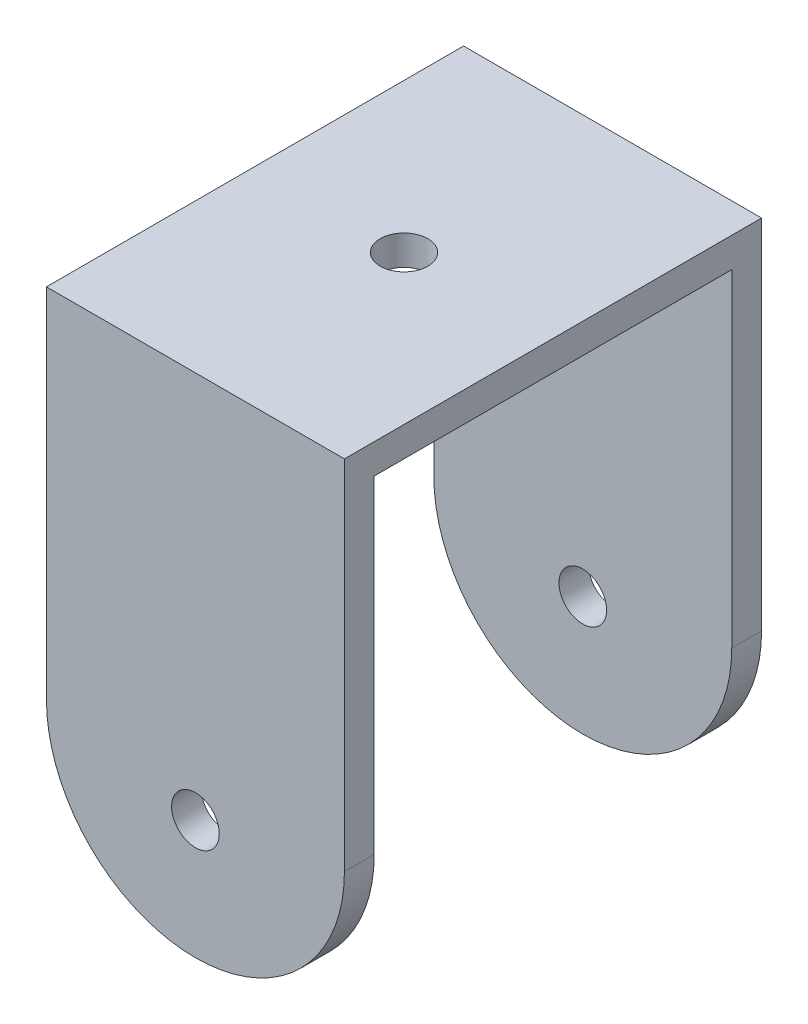
ISO-10303-21;
HEADER;
FILE_DESCRIPTION(('STEP AP214'),'2;1');
FILE_NAME('part.step','',(''),(''),'','','');
FILE_SCHEMA(('AUTOMOTIVE_DESIGN { 1 0 10303 214 1 1 1 1 }'));
ENDSEC;
DATA;
#1=APPLICATION_CONTEXT('core data for automotive mechanical design processes');
#2=APPLICATION_PROTOCOL_DEFINITION('international standard','automotive_design',2000,#1);
#3=PRODUCT_CONTEXT('',#1,'mechanical');
#4=PRODUCT('Part','Part','',(#3));
#5=PRODUCT_RELATED_PRODUCT_CATEGORY('part','',(#4));
#6=PRODUCT_DEFINITION_FORMATION('','',#4);
#7=PRODUCT_DEFINITION_CONTEXT('part definition',#1,'design');
#8=PRODUCT_DEFINITION('design','',#6,#7);
#9=PRODUCT_DEFINITION_SHAPE('','',#8);
#10=(LENGTH_UNIT() NAMED_UNIT(*) SI_UNIT(.MILLI.,.METRE.));
#11=(NAMED_UNIT(*) PLANE_ANGLE_UNIT() SI_UNIT($,.RADIAN.));
#12=(NAMED_UNIT(*) SI_UNIT($,.STERADIAN.) SOLID_ANGLE_UNIT());
#13=UNCERTAINTY_MEASURE_WITH_UNIT(LENGTH_MEASURE(1.E-05),#10,'distance_accuracy_value','');
#14=(GEOMETRIC_REPRESENTATION_CONTEXT(3) GLOBAL_UNCERTAINTY_ASSIGNED_CONTEXT((#13)) GLOBAL_UNIT_ASSIGNED_CONTEXT((#10,
#11,#12)) REPRESENTATION_CONTEXT('',''));
#15=CARTESIAN_POINT('',(0.,0.,0.));
#16=DIRECTION('',(0.,0.,1.));
#17=DIRECTION('',(1.,0.,0.));
#18=AXIS2_PLACEMENT_3D('',#15,#16,#17);
#19=CARTESIAN_POINT('',(0.,40.,0.));
#20=DIRECTION('',(0.,1.,0.));
#21=DIRECTION('',(-1.,0.,0.));
#22=AXIS2_PLACEMENT_3D('',#19,#20,#21);
#23=PLANE('',#22);
#24=CARTESIAN_POINT('',(0.,40.,35.));
#25=DIRECTION('',(0.,1.,0.));
#26=DIRECTION('',(-1.,0.,0.));
#27=AXIS2_PLACEMENT_3D('',#24,#25,#26);
#28=CIRCLE('',#27,4.);
#29=CARTESIAN_POINT('',(-4.00000000000001,40.,35.));
#30=VERTEX_POINT('',#29);
#31=EDGE_CURVE('E233',#30,#30,#28,.T.);
#32=ORIENTED_EDGE('',*,*,#31,.T.);
#33=EDGE_LOOP('',(#32));
#34=FACE_BOUND('',#33,.T.);
#35=DIRECTION('',(-1.,0.,0.));
#36=VECTOR('',#35,1.);
#37=CARTESIAN_POINT('',(25.,40.,65.));
#38=LINE('',#37,#36);
#39=CARTESIAN_POINT('',(25.,40.,65.));
#40=VERTEX_POINT('',#39);
#41=CARTESIAN_POINT('',(-25.,40.,65.));
#42=VERTEX_POINT('',#41);
#43=EDGE_CURVE('E129',#40,#42,#38,.T.);
#44=ORIENTED_EDGE('',*,*,#43,.T.);
#45=DIRECTION('',(0.,0.,1.));
#46=VECTOR('',#45,1.);
#47=CARTESIAN_POINT('',(-25.,40.,0.));
#48=LINE('',#47,#46);
#49=CARTESIAN_POINT('',(-25.,40.,5.));
#50=VERTEX_POINT('',#49);
#51=EDGE_CURVE('E138',#50,#42,#48,.T.);
#52=ORIENTED_EDGE('',*,*,#51,.F.);
#53=DIRECTION('',(-1.,0.,0.));
#54=VECTOR('',#53,1.);
#55=CARTESIAN_POINT('',(-25.,40.,5.));
#56=LINE('',#55,#54);
#57=CARTESIAN_POINT('',(25.,40.,5.));
#58=VERTEX_POINT('',#57);
#59=EDGE_CURVE('E135',#58,#50,#56,.T.);
#60=ORIENTED_EDGE('',*,*,#59,.F.);
#61=DIRECTION('',(0.,0.,-1.));
#62=VECTOR('',#61,1.);
#63=CARTESIAN_POINT('',(25.,40.,0.));
#64=LINE('',#63,#62);
#65=EDGE_CURVE('E122',#40,#58,#64,.T.);
#66=ORIENTED_EDGE('',*,*,#65,.F.);
#67=EDGE_LOOP('',(#44,#52,#60,#66));
#68=FACE_BOUND('',#67,.T.);
#69=ADVANCED_FACE('F39',(#34,#68),#23,.F.);
#70=CARTESIAN_POINT('',(25.,40.,5.));
#71=DIRECTION('',(-1.,0.,0.));
#72=DIRECTION('',(0.,-1.,0.));
#73=AXIS2_PLACEMENT_3D('',#70,#71,#72);
#74=PLANE('',#73);
#75=DIRECTION('',(0.,1.,0.));
#76=VECTOR('',#75,1.);
#77=CARTESIAN_POINT('',(25.,40.,5.));
#78=LINE('',#77,#76);
#79=CARTESIAN_POINT('',(25.,-15.,5.));
#80=VERTEX_POINT('',#79);
#81=EDGE_CURVE('E173',#80,#58,#78,.T.);
#82=ORIENTED_EDGE('',*,*,#81,.F.);
#83=DIRECTION('',(0.,0.,-1.));
#84=VECTOR('',#83,1.);
#85=CARTESIAN_POINT('',(25.,-15.,5.));
#86=LINE('',#85,#84);
#87=CARTESIAN_POINT('',(25.,-15.,0.));
#88=VERTEX_POINT('',#87);
#89=EDGE_CURVE('E214',#80,#88,#86,.T.);
#90=ORIENTED_EDGE('',*,*,#89,.T.);
#91=DIRECTION('',(0.,1.,0.));
#92=VECTOR('',#91,1.);
#93=CARTESIAN_POINT('',(25.,40.,0.));
#94=LINE('',#93,#92);
#95=CARTESIAN_POINT('',(25.,45.,0.));
#96=VERTEX_POINT('',#95);
#97=EDGE_CURVE('E172',#88,#96,#94,.T.);
#98=ORIENTED_EDGE('',*,*,#97,.T.);
#99=DIRECTION('',(0.,0.,-1.));
#100=VECTOR('',#99,1.);
#101=CARTESIAN_POINT('',(25.,45.,0.));
#102=LINE('',#101,#100);
#103=CARTESIAN_POINT('',(25.,45.,70.));
#104=VERTEX_POINT('',#103);
#105=EDGE_CURVE('E156',#104,#96,#102,.T.);
#106=ORIENTED_EDGE('',*,*,#105,.F.);
#107=DIRECTION('',(0.,-1.,0.));
#108=VECTOR('',#107,1.);
#109=CARTESIAN_POINT('',(25.,45.,70.));
#110=LINE('',#109,#108);
#111=CARTESIAN_POINT('',(25.,-15.,70.));
#112=VERTEX_POINT('',#111);
#113=EDGE_CURVE('E164',#104,#112,#110,.T.);
#114=ORIENTED_EDGE('',*,*,#113,.T.);
#115=DIRECTION('',(0.,0.,-1.));
#116=VECTOR('',#115,1.);
#117=CARTESIAN_POINT('',(25.,-15.,5.));
#118=LINE('',#117,#116);
#119=CARTESIAN_POINT('',(25.,-15.,65.));
#120=VERTEX_POINT('',#119);
#121=EDGE_CURVE('E126',#112,#120,#118,.T.);
#122=ORIENTED_EDGE('',*,*,#121,.T.);
#123=DIRECTION('',(0.,1.,0.));
#124=VECTOR('',#123,1.);
#125=CARTESIAN_POINT('',(25.,-40.,65.));
#126=LINE('',#125,#124);
#127=EDGE_CURVE('E118',#120,#40,#126,.T.);
#128=ORIENTED_EDGE('',*,*,#127,.T.);
#129=ORIENTED_EDGE('',*,*,#65,.T.);
#130=EDGE_LOOP('',(#82,#90,#98,#106,#114,#122,#128,#129));
#131=FACE_BOUND('',#130,.T.);
#132=ADVANCED_FACE('F121',(#131),#74,.F.);
#133=CARTESIAN_POINT('',(-25.,40.,5.));
#134=DIRECTION('',(1.,0.,0.));
#135=DIRECTION('',(0.,1.,0.));
#136=AXIS2_PLACEMENT_3D('',#133,#134,#135);
#137=PLANE('',#136);
#138=DIRECTION('',(0.,-1.,0.));
#139=VECTOR('',#138,1.);
#140=CARTESIAN_POINT('',(-25.,40.,0.));
#141=LINE('',#140,#139);
#142=CARTESIAN_POINT('',(-25.,45.,0.));
#143=VERTEX_POINT('',#142);
#144=CARTESIAN_POINT('',(-25.,-15.,0.));
#145=VERTEX_POINT('',#144);
#146=EDGE_CURVE('E176',#143,#145,#141,.T.);
#147=ORIENTED_EDGE('',*,*,#146,.T.);
#148=DIRECTION('',(0.,0.,-1.));
#149=VECTOR('',#148,1.);
#150=CARTESIAN_POINT('',(-25.,-15.,5.));
#151=LINE('',#150,#149);
#152=CARTESIAN_POINT('',(-25.,-15.,5.));
#153=VERTEX_POINT('',#152);
#154=EDGE_CURVE('E202',#145,#153,#151,.F.);
#155=ORIENTED_EDGE('',*,*,#154,.T.);
#156=DIRECTION('',(0.,-1.,0.));
#157=VECTOR('',#156,1.);
#158=CARTESIAN_POINT('',(-25.,40.,5.));
#159=LINE('',#158,#157);
#160=EDGE_CURVE('E179',#50,#153,#159,.T.);
#161=ORIENTED_EDGE('',*,*,#160,.F.);
#162=ORIENTED_EDGE('',*,*,#51,.T.);
#163=DIRECTION('',(0.,-1.,0.));
#164=VECTOR('',#163,1.);
#165=CARTESIAN_POINT('',(-25.,40.,65.));
#166=LINE('',#165,#164);
#167=CARTESIAN_POINT('',(-25.,-15.,65.));
#168=VERTEX_POINT('',#167);
#169=EDGE_CURVE('E143',#42,#168,#166,.T.);
#170=ORIENTED_EDGE('',*,*,#169,.T.);
#171=DIRECTION('',(0.,0.,-1.));
#172=VECTOR('',#171,1.);
#173=CARTESIAN_POINT('',(-25.,-15.,5.));
#174=LINE('',#173,#172);
#175=CARTESIAN_POINT('',(-25.,-15.,70.));
#176=VERTEX_POINT('',#175);
#177=EDGE_CURVE('E199',#168,#176,#174,.F.);
#178=ORIENTED_EDGE('',*,*,#177,.T.);
#179=DIRECTION('',(0.,-1.,0.));
#180=VECTOR('',#179,1.);
#181=CARTESIAN_POINT('',(-25.,45.,70.));
#182=LINE('',#181,#180);
#183=CARTESIAN_POINT('',(-25.,45.,70.));
#184=VERTEX_POINT('',#183);
#185=EDGE_CURVE('E169',#184,#176,#182,.T.);
#186=ORIENTED_EDGE('',*,*,#185,.F.);
#187=DIRECTION('',(0.,0.,1.));
#188=VECTOR('',#187,1.);
#189=CARTESIAN_POINT('',(-25.,45.,0.));
#190=LINE('',#189,#188);
#191=EDGE_CURVE('E137',#143,#184,#190,.T.);
#192=ORIENTED_EDGE('',*,*,#191,.F.);
#193=EDGE_LOOP('',(#147,#155,#161,#162,#170,#178,#186,#192));
#194=FACE_BOUND('',#193,.T.);
#195=ADVANCED_FACE('F242',(#194),#137,.F.);
#196=CARTESIAN_POINT('',(0.,0.,5.));
#197=DIRECTION('',(0.,0.,1.));
#198=DIRECTION('',(1.,0.,0.));
#199=AXIS2_PLACEMENT_3D('',#196,#197,#198);
#200=PLANE('',#199);
#201=CARTESIAN_POINT('',(0.,-20.,5.));
#202=DIRECTION('',(0.,0.,1.));
#203=DIRECTION('',(1.,0.,0.));
#204=AXIS2_PLACEMENT_3D('',#201,#202,#203);
#205=CIRCLE('',#204,4.);
#206=CARTESIAN_POINT('',(4.00000000000001,-20.,5.));
#207=VERTEX_POINT('',#206);
#208=EDGE_CURVE('E130',#207,#207,#205,.T.);
#209=ORIENTED_EDGE('',*,*,#208,.F.);
#210=EDGE_LOOP('',(#209));
#211=FACE_BOUND('',#210,.T.);
#212=ORIENTED_EDGE('',*,*,#160,.T.);
#213=CARTESIAN_POINT('',(0.,-15.,5.));
#214=DIRECTION('',(0.,0.,1.));
#215=DIRECTION('',(1.,0.,0.));
#216=AXIS2_PLACEMENT_3D('',#213,#214,#215);
#217=CIRCLE('',#216,25.);
#218=CARTESIAN_POINT('',(0.,-40.,5.));
#219=VERTEX_POINT('',#218);
#220=EDGE_CURVE('E209',#153,#219,#217,.T.);
#221=ORIENTED_EDGE('',*,*,#220,.T.);
#222=CARTESIAN_POINT('',(0.,-15.,5.));
#223=DIRECTION('',(0.,0.,1.));
#224=DIRECTION('',(1.,0.,0.));
#225=AXIS2_PLACEMENT_3D('',#222,#223,#224);
#226=CIRCLE('',#225,25.);
#227=EDGE_CURVE('E206',#219,#80,#226,.T.);
#228=ORIENTED_EDGE('',*,*,#227,.T.);
#229=ORIENTED_EDGE('',*,*,#81,.T.);
#230=ORIENTED_EDGE('',*,*,#59,.T.);
#231=EDGE_LOOP('',(#212,#221,#228,#229,#230));
#232=FACE_BOUND('',#231,.T.);
#233=ADVANCED_FACE('F246',(#211,#232),#200,.T.);
#234=CARTESIAN_POINT('',(0.,0.,0.));
#235=DIRECTION('',(0.,0.,1.));
#236=DIRECTION('',(1.,0.,0.));
#237=AXIS2_PLACEMENT_3D('',#234,#235,#236);
#238=PLANE('',#237);
#239=CARTESIAN_POINT('',(0.,-20.,0.));
#240=DIRECTION('',(0.,0.,1.));
#241=DIRECTION('',(1.,0.,0.));
#242=AXIS2_PLACEMENT_3D('',#239,#240,#241);
#243=CIRCLE('',#242,4.);
#244=CARTESIAN_POINT('',(4.00000000000001,-20.,0.));
#245=VERTEX_POINT('',#244);
#246=EDGE_CURVE('E193',#245,#245,#243,.T.);
#247=ORIENTED_EDGE('',*,*,#246,.T.);
#248=EDGE_LOOP('',(#247));
#249=FACE_BOUND('',#248,.T.);
#250=CARTESIAN_POINT('',(0.,-15.,0.));
#251=DIRECTION('',(0.,0.,1.));
#252=DIRECTION('',(1.,0.,0.));
#253=AXIS2_PLACEMENT_3D('',#250,#251,#252);
#254=CIRCLE('',#253,25.);
#255=CARTESIAN_POINT('',(0.,-40.,0.));
#256=VERTEX_POINT('',#255);
#257=EDGE_CURVE('E183',#88,#256,#254,.F.);
#258=ORIENTED_EDGE('',*,*,#257,.T.);
#259=CARTESIAN_POINT('',(0.,-15.,0.));
#260=DIRECTION('',(0.,0.,1.));
#261=DIRECTION('',(1.,0.,0.));
#262=AXIS2_PLACEMENT_3D('',#259,#260,#261);
#263=CIRCLE('',#262,25.);
#264=EDGE_CURVE('E196',#256,#145,#263,.F.);
#265=ORIENTED_EDGE('',*,*,#264,.T.);
#266=ORIENTED_EDGE('',*,*,#146,.F.);
#267=DIRECTION('',(-1.,0.,0.));
#268=VECTOR('',#267,1.);
#269=CARTESIAN_POINT('',(-25.,45.,0.));
#270=LINE('',#269,#268);
#271=EDGE_CURVE('E160',#96,#143,#270,.T.);
#272=ORIENTED_EDGE('',*,*,#271,.F.);
#273=ORIENTED_EDGE('',*,*,#97,.F.);
#274=EDGE_LOOP('',(#258,#265,#266,#272,#273));
#275=FACE_BOUND('',#274,.T.);
#276=ADVANCED_FACE('F254',(#249,#275),#238,.F.);
#277=CARTESIAN_POINT('',(-25.,45.,70.));
#278=DIRECTION('',(0.,0.,-1.));
#279=DIRECTION('',(-1.,0.,0.));
#280=AXIS2_PLACEMENT_3D('',#277,#278,#279);
#281=PLANE('',#280);
#282=CARTESIAN_POINT('',(0.,-20.,70.));
#283=DIRECTION('',(0.,0.,1.));
#284=DIRECTION('',(1.,0.,0.));
#285=AXIS2_PLACEMENT_3D('',#282,#283,#284);
#286=CIRCLE('',#285,4.);
#287=CARTESIAN_POINT('',(4.00000000000001,-20.,70.));
#288=VERTEX_POINT('',#287);
#289=EDGE_CURVE('E304',#288,#288,#286,.T.);
#290=ORIENTED_EDGE('',*,*,#289,.F.);
#291=EDGE_LOOP('',(#290));
#292=FACE_BOUND('',#291,.T.);
#293=CARTESIAN_POINT('',(0.,-15.,70.));
#294=DIRECTION('',(0.,0.,-1.));
#295=DIRECTION('',(-1.,0.,0.));
#296=AXIS2_PLACEMENT_3D('',#293,#294,#295);
#297=CIRCLE('',#296,25.);
#298=CARTESIAN_POINT('',(0.,-40.,70.));
#299=VERTEX_POINT('',#298);
#300=EDGE_CURVE('E49',#176,#299,#297,.F.);
#301=ORIENTED_EDGE('',*,*,#300,.T.);
#302=CARTESIAN_POINT('',(0.,-15.,70.));
#303=DIRECTION('',(0.,0.,-1.));
#304=DIRECTION('',(-1.,0.,0.));
#305=AXIS2_PLACEMENT_3D('',#302,#303,#304);
#306=CIRCLE('',#305,25.);
#307=EDGE_CURVE('E11',#299,#112,#306,.F.);
#308=ORIENTED_EDGE('',*,*,#307,.T.);
#309=ORIENTED_EDGE('',*,*,#113,.F.);
#310=DIRECTION('',(1.,0.,0.));
#311=VECTOR('',#310,1.);
#312=CARTESIAN_POINT('',(-25.,45.,70.));
#313=LINE('',#312,#311);
#314=EDGE_CURVE('E153',#184,#104,#313,.T.);
#315=ORIENTED_EDGE('',*,*,#314,.F.);
#316=ORIENTED_EDGE('',*,*,#185,.T.);
#317=EDGE_LOOP('',(#301,#308,#309,#315,#316));
#318=FACE_BOUND('',#317,.T.);
#319=ADVANCED_FACE('F261',(#292,#318),#281,.F.);
#320=CARTESIAN_POINT('',(0.,45.,0.));
#321=DIRECTION('',(0.,1.,0.));
#322=DIRECTION('',(-1.,0.,0.));
#323=AXIS2_PLACEMENT_3D('',#320,#321,#322);
#324=PLANE('',#323);
#325=CARTESIAN_POINT('',(0.,45.,35.));
#326=DIRECTION('',(0.,1.,0.));
#327=DIRECTION('',(-1.,0.,0.));
#328=AXIS2_PLACEMENT_3D('',#325,#326,#327);
#329=CIRCLE('',#328,4.);
#330=CARTESIAN_POINT('',(-4.00000000000001,45.,35.));
#331=VERTEX_POINT('',#330);
#332=EDGE_CURVE('E226',#331,#331,#329,.T.);
#333=ORIENTED_EDGE('',*,*,#332,.F.);
#334=EDGE_LOOP('',(#333));
#335=FACE_BOUND('',#334,.T.);
#336=ORIENTED_EDGE('',*,*,#191,.T.);
#337=ORIENTED_EDGE('',*,*,#314,.T.);
#338=ORIENTED_EDGE('',*,*,#105,.T.);
#339=ORIENTED_EDGE('',*,*,#271,.T.);
#340=EDGE_LOOP('',(#336,#337,#338,#339));
#341=FACE_BOUND('',#340,.T.);
#342=ADVANCED_FACE('F258',(#335,#341),#324,.T.);
#343=CARTESIAN_POINT('',(0.,0.,65.));
#344=DIRECTION('',(0.,0.,1.));
#345=DIRECTION('',(1.,0.,0.));
#346=AXIS2_PLACEMENT_3D('',#343,#344,#345);
#347=PLANE('',#346);
#348=CARTESIAN_POINT('',(0.,-20.,65.));
#349=DIRECTION('',(0.,0.,1.));
#350=DIRECTION('',(1.,0.,0.));
#351=AXIS2_PLACEMENT_3D('',#348,#349,#350);
#352=CIRCLE('',#351,4.);
#353=CARTESIAN_POINT('',(4.00000000000001,-20.,65.));
#354=VERTEX_POINT('',#353);
#355=EDGE_CURVE('E189',#354,#354,#352,.T.);
#356=ORIENTED_EDGE('',*,*,#355,.T.);
#357=EDGE_LOOP('',(#356));
#358=FACE_BOUND('',#357,.T.);
#359=ORIENTED_EDGE('',*,*,#127,.F.);
#360=CARTESIAN_POINT('',(0.,-15.,65.));
#361=DIRECTION('',(0.,0.,1.));
#362=DIRECTION('',(1.,0.,0.));
#363=AXIS2_PLACEMENT_3D('',#360,#361,#362);
#364=CIRCLE('',#363,25.);
#365=CARTESIAN_POINT('',(0.,-40.,65.));
#366=VERTEX_POINT('',#365);
#367=EDGE_CURVE('E63',#120,#366,#364,.F.);
#368=ORIENTED_EDGE('',*,*,#367,.T.);
#369=CARTESIAN_POINT('',(0.,-15.,65.));
#370=DIRECTION('',(0.,0.,1.));
#371=DIRECTION('',(1.,0.,0.));
#372=AXIS2_PLACEMENT_3D('',#369,#370,#371);
#373=CIRCLE('',#372,25.);
#374=EDGE_CURVE('E217',#366,#168,#373,.F.);
#375=ORIENTED_EDGE('',*,*,#374,.T.);
#376=ORIENTED_EDGE('',*,*,#169,.F.);
#377=ORIENTED_EDGE('',*,*,#43,.F.);
#378=EDGE_LOOP('',(#359,#368,#375,#376,#377));
#379=FACE_BOUND('',#378,.T.);
#380=ADVANCED_FACE('F141',(#358,#379),#347,.F.);
#381=CARTESIAN_POINT('',(0.,-20.,0.));
#382=DIRECTION('',(0.,0.,1.));
#383=DIRECTION('',(1.,0.,0.));
#384=AXIS2_PLACEMENT_3D('',#381,#382,#383);
#385=CYLINDRICAL_SURFACE('',#384,4.);
#386=ORIENTED_EDGE('',*,*,#289,.T.);
#387=EDGE_LOOP('',(#386));
#388=FACE_BOUND('',#387,.T.);
#389=ORIENTED_EDGE('',*,*,#355,.F.);
#390=EDGE_LOOP('',(#389));
#391=FACE_BOUND('',#390,.T.);
#392=ADVANCED_FACE('F286',(#388,#391),#385,.F.);
#393=ORIENTED_EDGE('',*,*,#208,.T.);
#394=EDGE_LOOP('',(#393));
#395=FACE_BOUND('',#394,.T.);
#396=ORIENTED_EDGE('',*,*,#246,.F.);
#397=EDGE_LOOP('',(#396));
#398=FACE_BOUND('',#397,.T.);
#399=ADVANCED_FACE('F288',(#395,#398),#385,.F.);
#400=CARTESIAN_POINT('',(0.,-40.,35.));
#401=DIRECTION('',(0.,1.,0.));
#402=DIRECTION('',(-1.,0.,0.));
#403=AXIS2_PLACEMENT_3D('',#400,#401,#402);
#404=CYLINDRICAL_SURFACE('',#403,4.);
#405=ORIENTED_EDGE('',*,*,#332,.T.);
#406=EDGE_LOOP('',(#405));
#407=FACE_BOUND('',#406,.T.);
#408=ORIENTED_EDGE('',*,*,#31,.F.);
#409=EDGE_LOOP('',(#408));
#410=FACE_BOUND('',#409,.T.);
#411=ADVANCED_FACE('F291',(#407,#410),#404,.F.);
#412=CARTESIAN_POINT('',(0.,-15.,5.));
#413=DIRECTION('',(0.,0.,-1.));
#414=DIRECTION('',(-1.,0.,0.));
#415=AXIS2_PLACEMENT_3D('',#412,#413,#414);
#416=CYLINDRICAL_SURFACE('',#415,25.);
#417=ORIENTED_EDGE('',*,*,#89,.F.);
#418=ORIENTED_EDGE('',*,*,#227,.F.);
#419=DIRECTION('',(0.,0.,-1.));
#420=VECTOR('',#419,1.);
#421=CARTESIAN_POINT('',(0.,-40.,5.));
#422=LINE('',#421,#420);
#423=EDGE_CURVE('E223',#256,#219,#422,.F.);
#424=ORIENTED_EDGE('',*,*,#423,.F.);
#425=ORIENTED_EDGE('',*,*,#257,.F.);
#426=EDGE_LOOP('',(#417,#418,#424,#425));
#427=FACE_BOUND('',#426,.T.);
#428=ADVANCED_FACE('F252',(#427),#416,.T.);
#429=CARTESIAN_POINT('',(0.,-15.,5.));
#430=DIRECTION('',(0.,0.,-1.));
#431=DIRECTION('',(-1.,0.,0.));
#432=AXIS2_PLACEMENT_3D('',#429,#430,#431);
#433=CYLINDRICAL_SURFACE('',#432,25.);
#434=ORIENTED_EDGE('',*,*,#220,.F.);
#435=ORIENTED_EDGE('',*,*,#154,.F.);
#436=ORIENTED_EDGE('',*,*,#264,.F.);
#437=ORIENTED_EDGE('',*,*,#423,.T.);
#438=EDGE_LOOP('',(#434,#435,#436,#437));
#439=FACE_BOUND('',#438,.T.);
#440=ADVANCED_FACE('F298',(#439),#433,.T.);
#441=CARTESIAN_POINT('',(0.,-15.,70.));
#442=DIRECTION('',(0.,0.,-1.));
#443=DIRECTION('',(-1.,0.,0.));
#444=AXIS2_PLACEMENT_3D('',#441,#442,#443);
#445=CYLINDRICAL_SURFACE('',#444,25.);
#446=DIRECTION('',(0.,0.,-1.));
#447=VECTOR('',#446,1.);
#448=CARTESIAN_POINT('',(0.,-40.,70.));
#449=LINE('',#448,#447);
#450=EDGE_CURVE('E43',#299,#366,#449,.T.);
#451=ORIENTED_EDGE('',*,*,#450,.F.);
#452=ORIENTED_EDGE('',*,*,#300,.F.);
#453=ORIENTED_EDGE('',*,*,#177,.F.);
#454=ORIENTED_EDGE('',*,*,#374,.F.);
#455=EDGE_LOOP('',(#451,#452,#453,#454));
#456=FACE_BOUND('',#455,.T.);
#457=ADVANCED_FACE('F41',(#456),#445,.T.);
#458=CARTESIAN_POINT('',(0.,-15.,5.));
#459=DIRECTION('',(0.,0.,-1.));
#460=DIRECTION('',(-1.,0.,0.));
#461=AXIS2_PLACEMENT_3D('',#458,#459,#460);
#462=CYLINDRICAL_SURFACE('',#461,25.);
#463=ORIENTED_EDGE('',*,*,#307,.F.);
#464=ORIENTED_EDGE('',*,*,#450,.T.);
#465=ORIENTED_EDGE('',*,*,#367,.F.);
#466=ORIENTED_EDGE('',*,*,#121,.F.);
#467=EDGE_LOOP('',(#463,#464,#465,#466));
#468=FACE_BOUND('',#467,.T.);
#469=ADVANCED_FACE('F238',(#468),#462,.T.);
#470=CLOSED_SHELL('',(#69,#132,#195,#233,#276,#319,#342,#380,#392,#399,#411,#428,#440,#457,#469));
#471=MANIFOLD_SOLID_BREP('B2',#470);
#472=ADVANCED_BREP_SHAPE_REPRESENTATION('',(#18,#471),#14);
#473=SHAPE_DEFINITION_REPRESENTATION(#9,#472);
ENDSEC;
END-ISO-10303-21;
